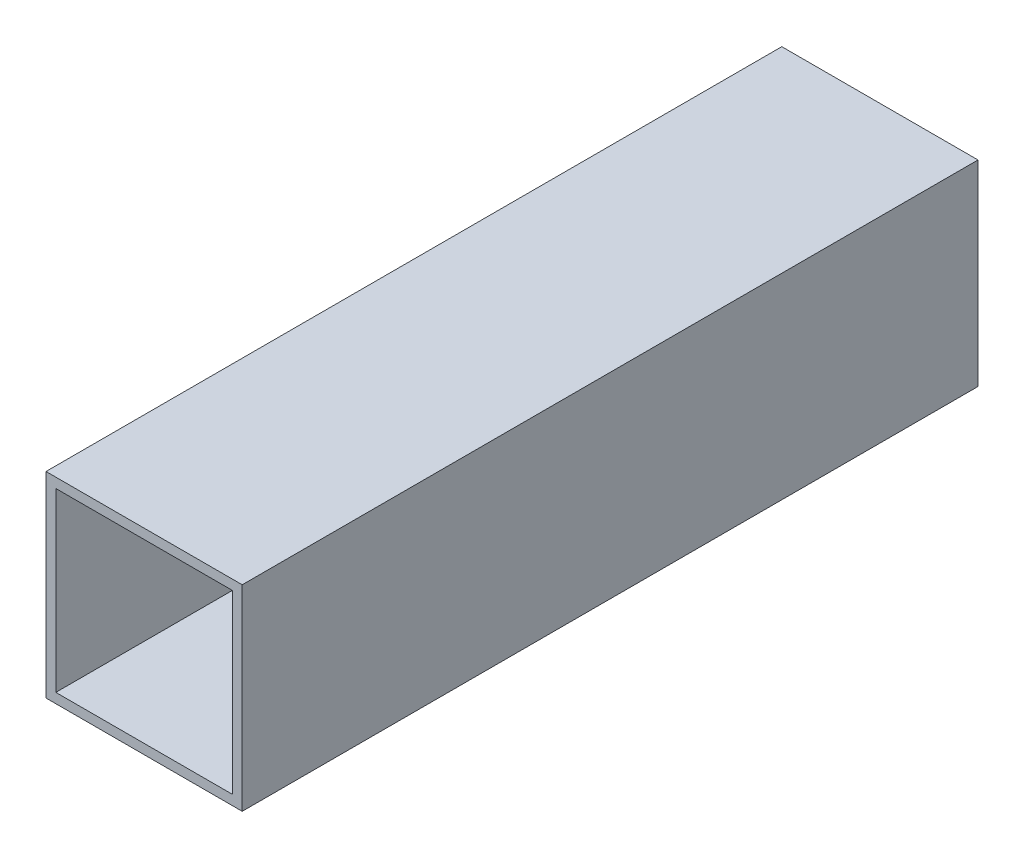
ISO-10303-21;
HEADER;
FILE_DESCRIPTION(('STEP AP214'),'2;1');
FILE_NAME('part.step','',(''),(''),'','','');
FILE_SCHEMA(('AUTOMOTIVE_DESIGN { 1 0 10303 214 1 1 1 1 }'));
ENDSEC;
DATA;
#1=APPLICATION_CONTEXT('core data for automotive mechanical design processes');
#2=APPLICATION_PROTOCOL_DEFINITION('international standard','automotive_design',2000,#1);
#3=PRODUCT_CONTEXT('',#1,'mechanical');
#4=PRODUCT('Part','Part','',(#3));
#5=PRODUCT_RELATED_PRODUCT_CATEGORY('part','',(#4));
#6=PRODUCT_DEFINITION_FORMATION('','',#4);
#7=PRODUCT_DEFINITION_CONTEXT('part definition',#1,'design');
#8=PRODUCT_DEFINITION('design','',#6,#7);
#9=PRODUCT_DEFINITION_SHAPE('','',#8);
#10=(LENGTH_UNIT() NAMED_UNIT(*) SI_UNIT(.MILLI.,.METRE.));
#11=(NAMED_UNIT(*) PLANE_ANGLE_UNIT() SI_UNIT($,.RADIAN.));
#12=(NAMED_UNIT(*) SI_UNIT($,.STERADIAN.) SOLID_ANGLE_UNIT());
#13=UNCERTAINTY_MEASURE_WITH_UNIT(LENGTH_MEASURE(1.E-05),#10,'distance_accuracy_value','');
#14=(GEOMETRIC_REPRESENTATION_CONTEXT(3) GLOBAL_UNCERTAINTY_ASSIGNED_CONTEXT((#13)) GLOBAL_UNIT_ASSIGNED_CONTEXT((#10,
#11,#12)) REPRESENTATION_CONTEXT('',''));
#15=CARTESIAN_POINT('',(0.,0.,0.));
#16=DIRECTION('',(0.,0.,1.));
#17=DIRECTION('',(1.,0.,0.));
#18=AXIS2_PLACEMENT_3D('',#15,#16,#17);
#19=CARTESIAN_POINT('',(0.,0.,187.5));
#20=DIRECTION('',(0.,0.,-1.));
#21=DIRECTION('',(-1.,0.,0.));
#22=AXIS2_PLACEMENT_3D('',#19,#20,#21);
#23=PLANE('',#22);
#24=DIRECTION('',(0.,-1.,0.));
#25=VECTOR('',#24,1.);
#26=CARTESIAN_POINT('',(-50.,-50.,187.5));
#27=LINE('',#26,#25);
#28=CARTESIAN_POINT('',(-50.,49.9999999999999,187.5));
#29=VERTEX_POINT('',#28);
#30=CARTESIAN_POINT('',(-50.,-50.,187.5));
#31=VERTEX_POINT('',#30);
#32=EDGE_CURVE('E133',#29,#31,#27,.T.);
#33=ORIENTED_EDGE('',*,*,#32,.T.);
#34=DIRECTION('',(1.,0.,0.));
#35=VECTOR('',#34,1.);
#36=CARTESIAN_POINT('',(-50.,-50.,187.5));
#37=LINE('',#36,#35);
#38=CARTESIAN_POINT('',(50.,-50.,187.5));
#39=VERTEX_POINT('',#38);
#40=EDGE_CURVE('E136',#31,#39,#37,.T.);
#41=ORIENTED_EDGE('',*,*,#40,.T.);
#42=DIRECTION('',(0.,1.,0.));
#43=VECTOR('',#42,1.);
#44=CARTESIAN_POINT('',(50.,-50.,187.5));
#45=LINE('',#44,#43);
#46=CARTESIAN_POINT('',(49.9999999999999,49.9999999999999,187.5));
#47=VERTEX_POINT('',#46);
#48=EDGE_CURVE('E139',#39,#47,#45,.T.);
#49=ORIENTED_EDGE('',*,*,#48,.T.);
#50=DIRECTION('',(-1.,0.,0.));
#51=VECTOR('',#50,1.);
#52=CARTESIAN_POINT('',(-50.,49.9999999999999,187.5));
#53=LINE('',#52,#51);
#54=EDGE_CURVE('E141',#47,#29,#53,.T.);
#55=ORIENTED_EDGE('',*,*,#54,.T.);
#56=EDGE_LOOP('',(#33,#41,#49,#55));
#57=FACE_BOUND('',#56,.T.);
#58=DIRECTION('',(0.,-1.,0.));
#59=VECTOR('',#58,1.);
#60=CARTESIAN_POINT('',(-45.,-45.,187.5));
#61=LINE('',#60,#59);
#62=CARTESIAN_POINT('',(-45.,44.9999999999999,187.5));
#63=VERTEX_POINT('',#62);
#64=CARTESIAN_POINT('',(-45.,-45.,187.5));
#65=VERTEX_POINT('',#64);
#66=EDGE_CURVE('E97',#63,#65,#61,.T.);
#67=ORIENTED_EDGE('',*,*,#66,.F.);
#68=DIRECTION('',(-1.,0.,0.));
#69=VECTOR('',#68,1.);
#70=CARTESIAN_POINT('',(-45.,44.9999999999999,187.5));
#71=LINE('',#70,#69);
#72=CARTESIAN_POINT('',(45.,44.9999999999999,187.5));
#73=VERTEX_POINT('',#72);
#74=EDGE_CURVE('E119',#73,#63,#71,.T.);
#75=ORIENTED_EDGE('',*,*,#74,.F.);
#76=DIRECTION('',(0.,1.,0.));
#77=VECTOR('',#76,1.);
#78=CARTESIAN_POINT('',(45.,-45.,187.5));
#79=LINE('',#78,#77);
#80=CARTESIAN_POINT('',(45.,-45.,187.5));
#81=VERTEX_POINT('',#80);
#82=EDGE_CURVE('E117',#81,#73,#79,.T.);
#83=ORIENTED_EDGE('',*,*,#82,.F.);
#84=DIRECTION('',(1.,0.,0.));
#85=VECTOR('',#84,1.);
#86=CARTESIAN_POINT('',(-45.,-45.,187.5));
#87=LINE('',#86,#85);
#88=EDGE_CURVE('E105',#65,#81,#87,.T.);
#89=ORIENTED_EDGE('',*,*,#88,.F.);
#90=EDGE_LOOP('',(#67,#75,#83,#89));
#91=FACE_BOUND('',#90,.T.);
#92=ADVANCED_FACE('F32',(#57,#91),#23,.F.);
#93=CARTESIAN_POINT('',(0.,0.,-187.5));
#94=DIRECTION('',(0.,0.,-1.));
#95=DIRECTION('',(-1.,0.,0.));
#96=AXIS2_PLACEMENT_3D('',#93,#94,#95);
#97=PLANE('',#96);
#98=DIRECTION('',(0.,-1.,0.));
#99=VECTOR('',#98,1.);
#100=CARTESIAN_POINT('',(-50.,-50.,-187.5));
#101=LINE('',#100,#99);
#102=CARTESIAN_POINT('',(-50.,49.9999999999999,-187.5));
#103=VERTEX_POINT('',#102);
#104=CARTESIAN_POINT('',(-50.,-50.,-187.5));
#105=VERTEX_POINT('',#104);
#106=EDGE_CURVE('E113',#103,#105,#101,.T.);
#107=ORIENTED_EDGE('',*,*,#106,.F.);
#108=DIRECTION('',(-1.,0.,0.));
#109=VECTOR('',#108,1.);
#110=CARTESIAN_POINT('',(-50.,49.9999999999999,-187.5));
#111=LINE('',#110,#109);
#112=CARTESIAN_POINT('',(49.9999999999999,49.9999999999999,-187.5));
#113=VERTEX_POINT('',#112);
#114=EDGE_CURVE('E137',#113,#103,#111,.T.);
#115=ORIENTED_EDGE('',*,*,#114,.F.);
#116=DIRECTION('',(0.,1.,0.));
#117=VECTOR('',#116,1.);
#118=CARTESIAN_POINT('',(50.,-50.,-187.5));
#119=LINE('',#118,#117);
#120=CARTESIAN_POINT('',(50.,-50.,-187.5));
#121=VERTEX_POINT('',#120);
#122=EDGE_CURVE('E148',#121,#113,#119,.T.);
#123=ORIENTED_EDGE('',*,*,#122,.F.);
#124=DIRECTION('',(1.,0.,0.));
#125=VECTOR('',#124,1.);
#126=CARTESIAN_POINT('',(-50.,-50.,-187.5));
#127=LINE('',#126,#125);
#128=EDGE_CURVE('E146',#105,#121,#127,.T.);
#129=ORIENTED_EDGE('',*,*,#128,.F.);
#130=EDGE_LOOP('',(#107,#115,#123,#129));
#131=FACE_BOUND('',#130,.T.);
#132=DIRECTION('',(-1.,0.,0.));
#133=VECTOR('',#132,1.);
#134=CARTESIAN_POINT('',(-45.,44.9999999999999,-187.5));
#135=LINE('',#134,#133);
#136=CARTESIAN_POINT('',(45.,44.9999999999999,-187.5));
#137=VERTEX_POINT('',#136);
#138=CARTESIAN_POINT('',(-45.,44.9999999999999,-187.5));
#139=VERTEX_POINT('',#138);
#140=EDGE_CURVE('E106',#137,#139,#135,.T.);
#141=ORIENTED_EDGE('',*,*,#140,.T.);
#142=DIRECTION('',(0.,-1.,0.));
#143=VECTOR('',#142,1.);
#144=CARTESIAN_POINT('',(-45.,-45.,-187.5));
#145=LINE('',#144,#143);
#146=CARTESIAN_POINT('',(-45.,-45.,-187.5));
#147=VERTEX_POINT('',#146);
#148=EDGE_CURVE('E55',#139,#147,#145,.T.);
#149=ORIENTED_EDGE('',*,*,#148,.T.);
#150=DIRECTION('',(1.,0.,0.));
#151=VECTOR('',#150,1.);
#152=CARTESIAN_POINT('',(-45.,-45.,-187.5));
#153=LINE('',#152,#151);
#154=CARTESIAN_POINT('',(45.,-45.,-187.5));
#155=VERTEX_POINT('',#154);
#156=EDGE_CURVE('E112',#147,#155,#153,.T.);
#157=ORIENTED_EDGE('',*,*,#156,.T.);
#158=DIRECTION('',(0.,1.,0.));
#159=VECTOR('',#158,1.);
#160=CARTESIAN_POINT('',(45.,-45.,-187.5));
#161=LINE('',#160,#159);
#162=EDGE_CURVE('E125',#155,#137,#161,.T.);
#163=ORIENTED_EDGE('',*,*,#162,.T.);
#164=EDGE_LOOP('',(#141,#149,#157,#163));
#165=FACE_BOUND('',#164,.T.);
#166=ADVANCED_FACE('F166',(#131,#165),#97,.T.);
#167=CARTESIAN_POINT('',(-50.,-50.,187.5));
#168=DIRECTION('',(1.,0.,0.));
#169=DIRECTION('',(0.,0.,-1.));
#170=AXIS2_PLACEMENT_3D('',#167,#168,#169);
#171=PLANE('',#170);
#172=ORIENTED_EDGE('',*,*,#106,.T.);
#173=DIRECTION('',(0.,0.,-1.));
#174=VECTOR('',#173,1.);
#175=CARTESIAN_POINT('',(-50.,-50.,187.5));
#176=LINE('',#175,#174);
#177=EDGE_CURVE('E11',#31,#105,#176,.T.);
#178=ORIENTED_EDGE('',*,*,#177,.F.);
#179=ORIENTED_EDGE('',*,*,#32,.F.);
#180=DIRECTION('',(0.,0.,-1.));
#181=VECTOR('',#180,1.);
#182=CARTESIAN_POINT('',(-50.,49.9999999999999,187.5));
#183=LINE('',#182,#181);
#184=EDGE_CURVE('E143',#29,#103,#183,.T.);
#185=ORIENTED_EDGE('',*,*,#184,.T.);
#186=EDGE_LOOP('',(#172,#178,#179,#185));
#187=FACE_BOUND('',#186,.T.);
#188=ADVANCED_FACE('F34',(#187),#171,.F.);
#189=CARTESIAN_POINT('',(-50.,-50.,187.5));
#190=DIRECTION('',(0.,1.,0.));
#191=DIRECTION('',(0.,0.,1.));
#192=AXIS2_PLACEMENT_3D('',#189,#190,#191);
#193=PLANE('',#192);
#194=ORIENTED_EDGE('',*,*,#128,.T.);
#195=DIRECTION('',(0.,0.,-1.));
#196=VECTOR('',#195,1.);
#197=CARTESIAN_POINT('',(50.,-50.,187.5));
#198=LINE('',#197,#196);
#199=EDGE_CURVE('E40',#39,#121,#198,.T.);
#200=ORIENTED_EDGE('',*,*,#199,.F.);
#201=ORIENTED_EDGE('',*,*,#40,.F.);
#202=ORIENTED_EDGE('',*,*,#177,.T.);
#203=EDGE_LOOP('',(#194,#200,#201,#202));
#204=FACE_BOUND('',#203,.T.);
#205=ADVANCED_FACE('F176',(#204),#193,.F.);
#206=CARTESIAN_POINT('',(50.,-50.,187.5));
#207=DIRECTION('',(-1.,0.,0.));
#208=DIRECTION('',(0.,-1.,0.));
#209=AXIS2_PLACEMENT_3D('',#206,#207,#208);
#210=PLANE('',#209);
#211=ORIENTED_EDGE('',*,*,#122,.T.);
#212=DIRECTION('',(0.,0.,-1.));
#213=VECTOR('',#212,1.);
#214=CARTESIAN_POINT('',(49.9999999999999,49.9999999999999,187.5));
#215=LINE('',#214,#213);
#216=EDGE_CURVE('E153',#47,#113,#215,.T.);
#217=ORIENTED_EDGE('',*,*,#216,.F.);
#218=ORIENTED_EDGE('',*,*,#48,.F.);
#219=ORIENTED_EDGE('',*,*,#199,.T.);
#220=EDGE_LOOP('',(#211,#217,#218,#219));
#221=FACE_BOUND('',#220,.T.);
#222=ADVANCED_FACE('F160',(#221),#210,.F.);
#223=CARTESIAN_POINT('',(-50.,49.9999999999999,187.5));
#224=DIRECTION('',(0.,-1.,0.));
#225=DIRECTION('',(0.,0.,-1.));
#226=AXIS2_PLACEMENT_3D('',#223,#224,#225);
#227=PLANE('',#226);
#228=ORIENTED_EDGE('',*,*,#114,.T.);
#229=ORIENTED_EDGE('',*,*,#184,.F.);
#230=ORIENTED_EDGE('',*,*,#54,.F.);
#231=ORIENTED_EDGE('',*,*,#216,.T.);
#232=EDGE_LOOP('',(#228,#229,#230,#231));
#233=FACE_BOUND('',#232,.T.);
#234=ADVANCED_FACE('F170',(#233),#227,.F.);
#235=CARTESIAN_POINT('',(-45.,-45.,187.5));
#236=DIRECTION('',(1.,0.,0.));
#237=DIRECTION('',(0.,0.,-1.));
#238=AXIS2_PLACEMENT_3D('',#235,#236,#237);
#239=PLANE('',#238);
#240=ORIENTED_EDGE('',*,*,#148,.F.);
#241=DIRECTION('',(0.,0.,-1.));
#242=VECTOR('',#241,1.);
#243=CARTESIAN_POINT('',(-45.,44.9999999999999,187.5));
#244=LINE('',#243,#242);
#245=EDGE_CURVE('E101',#63,#139,#244,.T.);
#246=ORIENTED_EDGE('',*,*,#245,.F.);
#247=ORIENTED_EDGE('',*,*,#66,.T.);
#248=DIRECTION('',(0.,0.,-1.));
#249=VECTOR('',#248,1.);
#250=CARTESIAN_POINT('',(-45.,-45.,187.5));
#251=LINE('',#250,#249);
#252=EDGE_CURVE('E100',#65,#147,#251,.T.);
#253=ORIENTED_EDGE('',*,*,#252,.T.);
#254=EDGE_LOOP('',(#240,#246,#247,#253));
#255=FACE_BOUND('',#254,.T.);
#256=ADVANCED_FACE('F99',(#255),#239,.T.);
#257=CARTESIAN_POINT('',(-45.,-45.,187.5));
#258=DIRECTION('',(0.,1.,0.));
#259=DIRECTION('',(0.,0.,1.));
#260=AXIS2_PLACEMENT_3D('',#257,#258,#259);
#261=PLANE('',#260);
#262=ORIENTED_EDGE('',*,*,#156,.F.);
#263=ORIENTED_EDGE('',*,*,#252,.F.);
#264=ORIENTED_EDGE('',*,*,#88,.T.);
#265=DIRECTION('',(0.,0.,-1.));
#266=VECTOR('',#265,1.);
#267=CARTESIAN_POINT('',(45.,-45.,187.5));
#268=LINE('',#267,#266);
#269=EDGE_CURVE('E114',#81,#155,#268,.T.);
#270=ORIENTED_EDGE('',*,*,#269,.T.);
#271=EDGE_LOOP('',(#262,#263,#264,#270));
#272=FACE_BOUND('',#271,.T.);
#273=ADVANCED_FACE('F109',(#272),#261,.T.);
#274=CARTESIAN_POINT('',(45.,-45.,187.5));
#275=DIRECTION('',(-1.,0.,0.));
#276=DIRECTION('',(0.,-1.,0.));
#277=AXIS2_PLACEMENT_3D('',#274,#275,#276);
#278=PLANE('',#277);
#279=ORIENTED_EDGE('',*,*,#162,.F.);
#280=ORIENTED_EDGE('',*,*,#269,.F.);
#281=ORIENTED_EDGE('',*,*,#82,.T.);
#282=DIRECTION('',(0.,0.,-1.));
#283=VECTOR('',#282,1.);
#284=CARTESIAN_POINT('',(45.,44.9999999999999,187.5));
#285=LINE('',#284,#283);
#286=EDGE_CURVE('E47',#73,#137,#285,.T.);
#287=ORIENTED_EDGE('',*,*,#286,.T.);
#288=EDGE_LOOP('',(#279,#280,#281,#287));
#289=FACE_BOUND('',#288,.T.);
#290=ADVANCED_FACE('F199',(#289),#278,.T.);
#291=CARTESIAN_POINT('',(-45.,44.9999999999999,187.5));
#292=DIRECTION('',(0.,-1.,0.));
#293=DIRECTION('',(0.,0.,-1.));
#294=AXIS2_PLACEMENT_3D('',#291,#292,#293);
#295=PLANE('',#294);
#296=ORIENTED_EDGE('',*,*,#140,.F.);
#297=ORIENTED_EDGE('',*,*,#286,.F.);
#298=ORIENTED_EDGE('',*,*,#74,.T.);
#299=ORIENTED_EDGE('',*,*,#245,.T.);
#300=EDGE_LOOP('',(#296,#297,#298,#299));
#301=FACE_BOUND('',#300,.T.);
#302=ADVANCED_FACE('F203',(#301),#295,.T.);
#303=CLOSED_SHELL('',(#92,#166,#188,#205,#222,#234,#256,#273,#290,#302));
#304=MANIFOLD_SOLID_BREP('B2',#303);
#305=ADVANCED_BREP_SHAPE_REPRESENTATION('',(#18,#304),#14);
#306=SHAPE_DEFINITION_REPRESENTATION(#9,#305);
ENDSEC;
END-ISO-10303-21;
